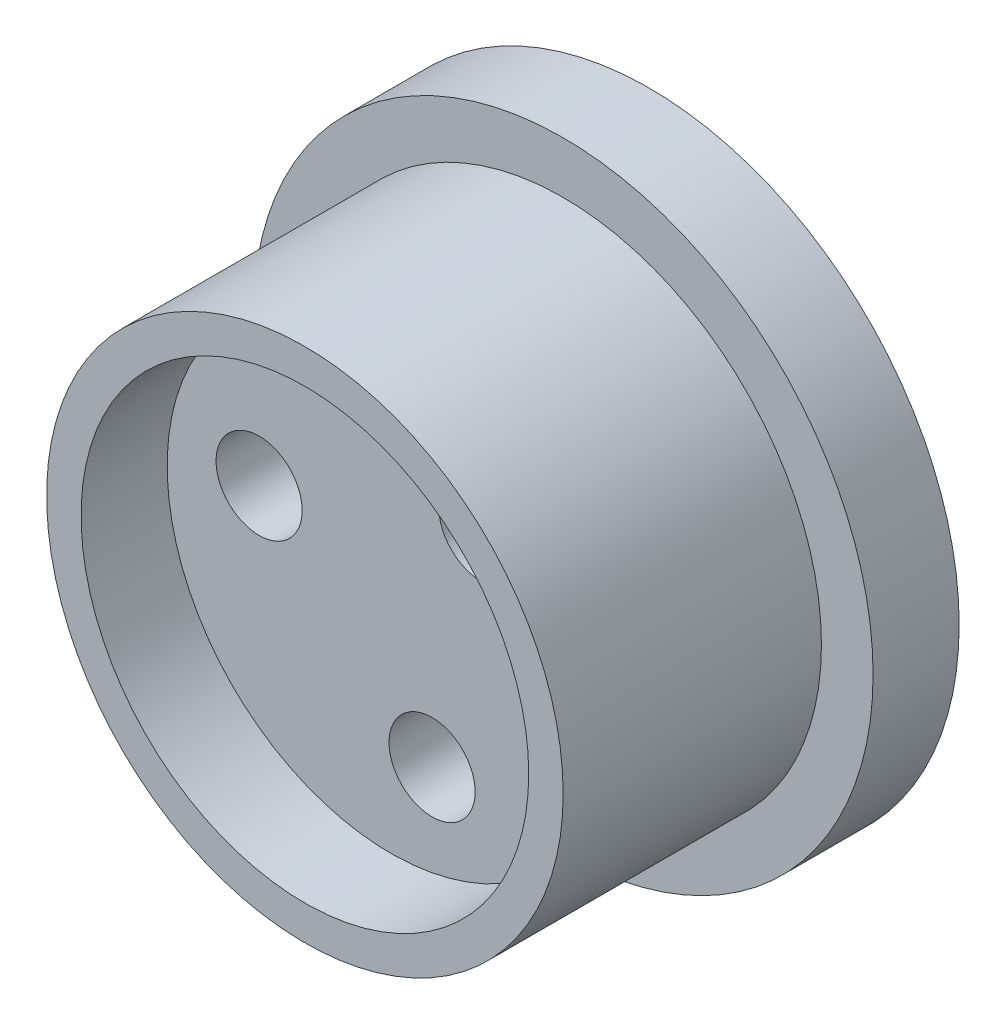
ISO-10303-21;
HEADER;
FILE_DESCRIPTION(('STEP AP214'),'2;1');
FILE_NAME('part.step','',(''),(''),'','','');
FILE_SCHEMA(('AUTOMOTIVE_DESIGN { 1 0 10303 214 1 1 1 1 }'));
ENDSEC;
DATA;
#1=APPLICATION_CONTEXT('core data for automotive mechanical design processes');
#2=APPLICATION_PROTOCOL_DEFINITION('international standard','automotive_design',2000,#1);
#3=PRODUCT_CONTEXT('',#1,'mechanical');
#4=PRODUCT('Part','Part','',(#3));
#5=PRODUCT_RELATED_PRODUCT_CATEGORY('part','',(#4));
#6=PRODUCT_DEFINITION_FORMATION('','',#4);
#7=PRODUCT_DEFINITION_CONTEXT('part definition',#1,'design');
#8=PRODUCT_DEFINITION('design','',#6,#7);
#9=PRODUCT_DEFINITION_SHAPE('','',#8);
#10=(LENGTH_UNIT() NAMED_UNIT(*) SI_UNIT(.MILLI.,.METRE.));
#11=(NAMED_UNIT(*) PLANE_ANGLE_UNIT() SI_UNIT($,.RADIAN.));
#12=(NAMED_UNIT(*) SI_UNIT($,.STERADIAN.) SOLID_ANGLE_UNIT());
#13=UNCERTAINTY_MEASURE_WITH_UNIT(LENGTH_MEASURE(1.E-05),#10,'distance_accuracy_value','');
#14=(GEOMETRIC_REPRESENTATION_CONTEXT(3) GLOBAL_UNCERTAINTY_ASSIGNED_CONTEXT((#13)) GLOBAL_UNIT_ASSIGNED_CONTEXT((#10,
#11,#12)) REPRESENTATION_CONTEXT('',''));
#15=CARTESIAN_POINT('',(0.,0.,0.));
#16=DIRECTION('',(0.,0.,1.));
#17=DIRECTION('',(1.,0.,0.));
#18=AXIS2_PLACEMENT_3D('',#15,#16,#17);
#19=CARTESIAN_POINT('',(0.,0.,5.));
#20=DIRECTION('',(0.,0.,-1.));
#21=DIRECTION('',(-1.,0.,0.));
#22=AXIS2_PLACEMENT_3D('',#19,#20,#21);
#23=CYLINDRICAL_SURFACE('',#22,18.);
#24=CARTESIAN_POINT('',(0.,0.,5.));
#25=DIRECTION('',(0.,0.,1.));
#26=DIRECTION('',(1.,0.,0.));
#27=AXIS2_PLACEMENT_3D('',#24,#25,#26);
#28=CIRCLE('',#27,18.);
#29=CARTESIAN_POINT('',(18.,0.,5.));
#30=VERTEX_POINT('',#29);
#31=EDGE_CURVE('E39',#30,#30,#28,.T.);
#32=ORIENTED_EDGE('',*,*,#31,.F.);
#33=EDGE_LOOP('',(#32));
#34=FACE_BOUND('',#33,.T.);
#35=CARTESIAN_POINT('',(0.,0.,0.));
#36=DIRECTION('',(0.,0.,1.));
#37=DIRECTION('',(1.,0.,0.));
#38=AXIS2_PLACEMENT_3D('',#35,#36,#37);
#39=CIRCLE('',#38,18.);
#40=CARTESIAN_POINT('',(18.,0.,0.));
#41=VERTEX_POINT('',#40);
#42=EDGE_CURVE('E48',#41,#41,#39,.T.);
#43=ORIENTED_EDGE('',*,*,#42,.T.);
#44=EDGE_LOOP('',(#43));
#45=FACE_BOUND('',#44,.T.);
#46=ADVANCED_FACE('F33',(#34,#45),#23,.T.);
#47=CARTESIAN_POINT('',(0.,0.,5.));
#48=DIRECTION('',(0.,0.,1.));
#49=DIRECTION('',(1.,0.,0.));
#50=AXIS2_PLACEMENT_3D('',#47,#48,#49);
#51=PLANE('',#50);
#52=CARTESIAN_POINT('',(0.,0.,5.));
#53=DIRECTION('',(0.,0.,1.));
#54=DIRECTION('',(1.,0.,0.));
#55=AXIS2_PLACEMENT_3D('',#52,#53,#54);
#56=CIRCLE('',#55,15.);
#57=CARTESIAN_POINT('',(15.,0.,5.));
#58=VERTEX_POINT('',#57);
#59=EDGE_CURVE('E43',#58,#58,#56,.T.);
#60=ORIENTED_EDGE('',*,*,#59,.F.);
#61=EDGE_LOOP('',(#60));
#62=FACE_BOUND('',#61,.T.);
#63=ORIENTED_EDGE('',*,*,#31,.T.);
#64=EDGE_LOOP('',(#63));
#65=FACE_BOUND('',#64,.T.);
#66=ADVANCED_FACE('F111',(#62,#65),#51,.T.);
#67=CARTESIAN_POINT('',(0.,0.,0.));
#68=DIRECTION('',(0.,0.,1.));
#69=DIRECTION('',(1.,0.,0.));
#70=AXIS2_PLACEMENT_3D('',#67,#68,#69);
#71=PLANE('',#70);
#72=CARTESIAN_POINT('',(-7.66,1.66639407662554,0.));
#73=DIRECTION('',(0.,0.,1.));
#74=DIRECTION('',(1.,0.,0.));
#75=AXIS2_PLACEMENT_3D('',#72,#73,#74);
#76=CIRCLE('',#75,2.5);
#77=CARTESIAN_POINT('',(-5.16,1.66639407662554,0.));
#78=VERTEX_POINT('',#77);
#79=EDGE_CURVE('E60',#78,#78,#76,.T.);
#80=ORIENTED_EDGE('',*,*,#79,.T.);
#81=EDGE_LOOP('',(#80));
#82=FACE_BOUND('',#81,.T.);
#83=CARTESIAN_POINT('',(5.27313960307344,5.8005575546766,0.));
#84=DIRECTION('',(0.,0.,1.));
#85=DIRECTION('',(1.,0.,0.));
#86=AXIS2_PLACEMENT_3D('',#83,#84,#85);
#87=CIRCLE('',#86,2.5);
#88=CARTESIAN_POINT('',(7.77313960307344,5.8005575546766,0.));
#89=VERTEX_POINT('',#88);
#90=EDGE_CURVE('E72',#89,#89,#87,.T.);
#91=ORIENTED_EDGE('',*,*,#90,.T.);
#92=EDGE_LOOP('',(#91));
#93=FACE_BOUND('',#92,.T.);
#94=CARTESIAN_POINT('',(2.38686039692677,-7.46695163130112,0.));
#95=DIRECTION('',(0.,0.,1.));
#96=DIRECTION('',(1.,0.,0.));
#97=AXIS2_PLACEMENT_3D('',#94,#95,#96);
#98=CIRCLE('',#97,2.5);
#99=CARTESIAN_POINT('',(4.88686039692677,-7.46695163130112,0.));
#100=VERTEX_POINT('',#99);
#101=EDGE_CURVE('E66',#100,#100,#98,.T.);
#102=ORIENTED_EDGE('',*,*,#101,.T.);
#103=EDGE_LOOP('',(#102));
#104=FACE_BOUND('',#103,.T.);
#105=ORIENTED_EDGE('',*,*,#42,.F.);
#106=EDGE_LOOP('',(#105));
#107=FACE_BOUND('',#106,.T.);
#108=ADVANCED_FACE('F81',(#82,#93,#104,#107),#71,.F.);
#109=CARTESIAN_POINT('',(0.,0.,20.));
#110=DIRECTION('',(0.,0.,-1.));
#111=DIRECTION('',(-1.,0.,0.));
#112=AXIS2_PLACEMENT_3D('',#109,#110,#111);
#113=CYLINDRICAL_SURFACE('',#112,13.);
#114=CARTESIAN_POINT('',(0.,0.,15.));
#115=DIRECTION('',(0.,0.,1.));
#116=DIRECTION('',(1.,0.,0.));
#117=AXIS2_PLACEMENT_3D('',#114,#115,#116);
#118=CIRCLE('',#117,13.);
#119=CARTESIAN_POINT('',(13.,0.,15.));
#120=VERTEX_POINT('',#119);
#121=EDGE_CURVE('E10',#120,#120,#118,.T.);
#122=ORIENTED_EDGE('',*,*,#121,.F.);
#123=EDGE_LOOP('',(#122));
#124=FACE_BOUND('',#123,.T.);
#125=CARTESIAN_POINT('',(0.,0.,20.));
#126=DIRECTION('',(0.,0.,1.));
#127=DIRECTION('',(1.,0.,0.));
#128=AXIS2_PLACEMENT_3D('',#125,#126,#127);
#129=CIRCLE('',#128,13.);
#130=CARTESIAN_POINT('',(13.,0.,20.));
#131=VERTEX_POINT('',#130);
#132=EDGE_CURVE('E56',#131,#131,#129,.T.);
#133=ORIENTED_EDGE('',*,*,#132,.T.);
#134=EDGE_LOOP('',(#133));
#135=FACE_BOUND('',#134,.T.);
#136=ADVANCED_FACE('F121',(#124,#135),#113,.F.);
#137=CARTESIAN_POINT('',(0.,0.,20.));
#138=DIRECTION('',(0.,0.,-1.));
#139=DIRECTION('',(-1.,0.,0.));
#140=AXIS2_PLACEMENT_3D('',#137,#138,#139);
#141=CYLINDRICAL_SURFACE('',#140,15.);
#142=ORIENTED_EDGE('',*,*,#59,.T.);
#143=EDGE_LOOP('',(#142));
#144=FACE_BOUND('',#143,.T.);
#145=CARTESIAN_POINT('',(0.,0.,20.));
#146=DIRECTION('',(0.,0.,1.));
#147=DIRECTION('',(1.,0.,0.));
#148=AXIS2_PLACEMENT_3D('',#145,#146,#147);
#149=CIRCLE('',#148,15.);
#150=CARTESIAN_POINT('',(15.,0.,20.));
#151=VERTEX_POINT('',#150);
#152=EDGE_CURVE('E52',#151,#151,#149,.T.);
#153=ORIENTED_EDGE('',*,*,#152,.F.);
#154=EDGE_LOOP('',(#153));
#155=FACE_BOUND('',#154,.T.);
#156=ADVANCED_FACE('F126',(#144,#155),#141,.T.);
#157=CARTESIAN_POINT('',(0.,0.,20.));
#158=DIRECTION('',(0.,0.,1.));
#159=DIRECTION('',(1.,0.,0.));
#160=AXIS2_PLACEMENT_3D('',#157,#158,#159);
#161=PLANE('',#160);
#162=ORIENTED_EDGE('',*,*,#132,.F.);
#163=EDGE_LOOP('',(#162));
#164=FACE_BOUND('',#163,.T.);
#165=ORIENTED_EDGE('',*,*,#152,.T.);
#166=EDGE_LOOP('',(#165));
#167=FACE_BOUND('',#166,.T.);
#168=ADVANCED_FACE('F95',(#164,#167),#161,.T.);
#169=CARTESIAN_POINT('',(0.,0.,15.));
#170=DIRECTION('',(0.,0.,1.));
#171=DIRECTION('',(1.,0.,0.));
#172=AXIS2_PLACEMENT_3D('',#169,#170,#171);
#173=PLANE('',#172);
#174=CARTESIAN_POINT('',(-7.66,1.66639407662554,15.));
#175=DIRECTION('',(0.,0.,1.));
#176=DIRECTION('',(1.,0.,0.));
#177=AXIS2_PLACEMENT_3D('',#174,#175,#176);
#178=CIRCLE('',#177,2.5);
#179=CARTESIAN_POINT('',(-5.16,1.66639407662554,15.));
#180=VERTEX_POINT('',#179);
#181=EDGE_CURVE('E75',#180,#180,#178,.T.);
#182=ORIENTED_EDGE('',*,*,#181,.F.);
#183=EDGE_LOOP('',(#182));
#184=FACE_BOUND('',#183,.T.);
#185=CARTESIAN_POINT('',(5.27313960307344,5.8005575546766,15.));
#186=DIRECTION('',(0.,0.,1.));
#187=DIRECTION('',(1.,0.,0.));
#188=AXIS2_PLACEMENT_3D('',#185,#186,#187);
#189=CIRCLE('',#188,2.5);
#190=CARTESIAN_POINT('',(7.77313960307344,5.8005575546766,15.));
#191=VERTEX_POINT('',#190);
#192=EDGE_CURVE('E69',#191,#191,#189,.T.);
#193=ORIENTED_EDGE('',*,*,#192,.F.);
#194=EDGE_LOOP('',(#193));
#195=FACE_BOUND('',#194,.T.);
#196=CARTESIAN_POINT('',(2.38686039692677,-7.46695163130112,15.));
#197=DIRECTION('',(0.,0.,1.));
#198=DIRECTION('',(1.,0.,0.));
#199=AXIS2_PLACEMENT_3D('',#196,#197,#198);
#200=CIRCLE('',#199,2.5);
#201=CARTESIAN_POINT('',(4.88686039692677,-7.46695163130112,15.));
#202=VERTEX_POINT('',#201);
#203=EDGE_CURVE('E63',#202,#202,#200,.T.);
#204=ORIENTED_EDGE('',*,*,#203,.F.);
#205=EDGE_LOOP('',(#204));
#206=FACE_BOUND('',#205,.T.);
#207=ORIENTED_EDGE('',*,*,#121,.T.);
#208=EDGE_LOOP('',(#207));
#209=FACE_BOUND('',#208,.T.);
#210=ADVANCED_FACE('F91',(#184,#195,#206,#209),#173,.T.);
#211=CARTESIAN_POINT('',(2.38686039692677,-7.46695163130112,0.));
#212=DIRECTION('',(0.,0.,1.));
#213=DIRECTION('',(1.,0.,0.));
#214=AXIS2_PLACEMENT_3D('',#211,#212,#213);
#215=CYLINDRICAL_SURFACE('',#214,2.5);
#216=ORIENTED_EDGE('',*,*,#101,.F.);
#217=EDGE_LOOP('',(#216));
#218=FACE_BOUND('',#217,.T.);
#219=ORIENTED_EDGE('',*,*,#203,.T.);
#220=EDGE_LOOP('',(#219));
#221=FACE_BOUND('',#220,.T.);
#222=ADVANCED_FACE('F94',(#218,#221),#215,.F.);
#223=CARTESIAN_POINT('',(5.27313960307344,5.8005575546766,0.));
#224=DIRECTION('',(0.,0.,1.));
#225=DIRECTION('',(1.,0.,0.));
#226=AXIS2_PLACEMENT_3D('',#223,#224,#225);
#227=CYLINDRICAL_SURFACE('',#226,2.5);
#228=ORIENTED_EDGE('',*,*,#90,.F.);
#229=EDGE_LOOP('',(#228));
#230=FACE_BOUND('',#229,.T.);
#231=ORIENTED_EDGE('',*,*,#192,.T.);
#232=EDGE_LOOP('',(#231));
#233=FACE_BOUND('',#232,.T.);
#234=ADVANCED_FACE('F87',(#230,#233),#227,.F.);
#235=CARTESIAN_POINT('',(-7.66,1.66639407662554,0.));
#236=DIRECTION('',(0.,0.,1.));
#237=DIRECTION('',(1.,0.,0.));
#238=AXIS2_PLACEMENT_3D('',#235,#236,#237);
#239=CYLINDRICAL_SURFACE('',#238,2.5);
#240=ORIENTED_EDGE('',*,*,#79,.F.);
#241=EDGE_LOOP('',(#240));
#242=FACE_BOUND('',#241,.T.);
#243=ORIENTED_EDGE('',*,*,#181,.T.);
#244=EDGE_LOOP('',(#243));
#245=FACE_BOUND('',#244,.T.);
#246=ADVANCED_FACE('F84',(#242,#245),#239,.F.);
#247=CLOSED_SHELL('',(#46,#66,#108,#136,#156,#168,#210,#222,#234,#246));
#248=MANIFOLD_SOLID_BREP('B2',#247);
#249=ADVANCED_BREP_SHAPE_REPRESENTATION('',(#18,#248),#14);
#250=SHAPE_DEFINITION_REPRESENTATION(#9,#249);
ENDSEC;
END-ISO-10303-21;
